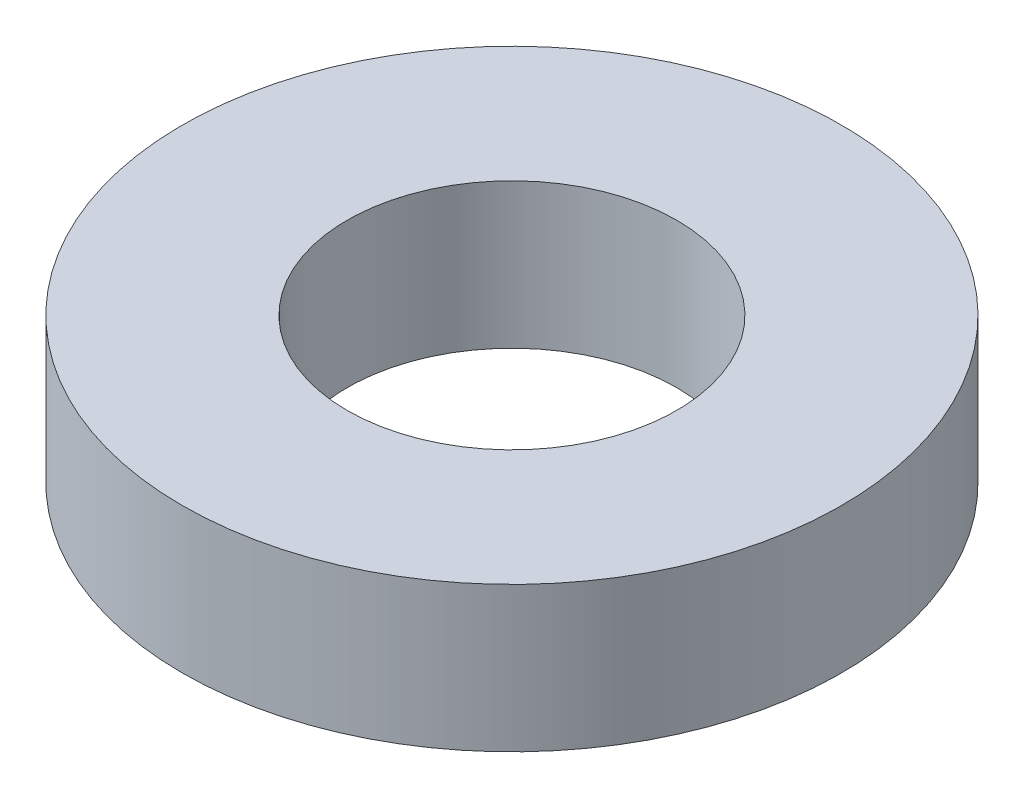
ISO-10303-21;
HEADER;
FILE_DESCRIPTION(('STEP AP214'),'2;1');
FILE_NAME('part.step','',(''),(''),'','','');
FILE_SCHEMA(('AUTOMOTIVE_DESIGN { 1 0 10303 214 1 1 1 1 }'));
ENDSEC;
DATA;
#1=APPLICATION_CONTEXT('core data for automotive mechanical design processes');
#2=APPLICATION_PROTOCOL_DEFINITION('international standard','automotive_design',2000,#1);
#3=PRODUCT_CONTEXT('',#1,'mechanical');
#4=PRODUCT('Part','Part','',(#3));
#5=PRODUCT_RELATED_PRODUCT_CATEGORY('part','',(#4));
#6=PRODUCT_DEFINITION_FORMATION('','',#4);
#7=PRODUCT_DEFINITION_CONTEXT('part definition',#1,'design');
#8=PRODUCT_DEFINITION('design','',#6,#7);
#9=PRODUCT_DEFINITION_SHAPE('','',#8);
#10=(LENGTH_UNIT() NAMED_UNIT(*) SI_UNIT(.MILLI.,.METRE.));
#11=(NAMED_UNIT(*) PLANE_ANGLE_UNIT() SI_UNIT($,.RADIAN.));
#12=(NAMED_UNIT(*) SI_UNIT($,.STERADIAN.) SOLID_ANGLE_UNIT());
#13=UNCERTAINTY_MEASURE_WITH_UNIT(LENGTH_MEASURE(1.E-05),#10,'distance_accuracy_value','');
#14=(GEOMETRIC_REPRESENTATION_CONTEXT(3) GLOBAL_UNCERTAINTY_ASSIGNED_CONTEXT((#13)) GLOBAL_UNIT_ASSIGNED_CONTEXT((#10,
#11,#12)) REPRESENTATION_CONTEXT('',''));
#15=CARTESIAN_POINT('',(0.,0.,0.));
#16=DIRECTION('',(0.,0.,1.));
#17=DIRECTION('',(1.,0.,0.));
#18=AXIS2_PLACEMENT_3D('',#15,#16,#17);
#19=CARTESIAN_POINT('',(0.,0.66,0.));
#20=DIRECTION('',(0.,1.,0.));
#21=DIRECTION('',(0.,0.,1.));
#22=AXIS2_PLACEMENT_3D('',#19,#20,#21);
#23=PLANE('',#22);
#24=CARTESIAN_POINT('',(0.,0.66,0.));
#25=DIRECTION('',(0.,1.,0.));
#26=DIRECTION('',(0.,0.,1.));
#27=AXIS2_PLACEMENT_3D('',#24,#25,#26);
#28=CIRCLE('',#27,3.);
#29=CARTESIAN_POINT('',(0.,0.66,3.));
#30=VERTEX_POINT('',#29);
#31=EDGE_CURVE('E10',#30,#30,#28,.T.);
#32=ORIENTED_EDGE('',*,*,#31,.T.);
#33=EDGE_LOOP('',(#32));
#34=FACE_BOUND('',#33,.T.);
#35=CARTESIAN_POINT('',(0.,0.66,0.));
#36=DIRECTION('',(0.,1.,0.));
#37=DIRECTION('',(0.,0.,1.));
#38=AXIS2_PLACEMENT_3D('',#35,#36,#37);
#39=CIRCLE('',#38,1.5);
#40=CARTESIAN_POINT('',(0.,0.66,1.5));
#41=VERTEX_POINT('',#40);
#42=EDGE_CURVE('E42',#41,#41,#39,.T.);
#43=ORIENTED_EDGE('',*,*,#42,.F.);
#44=EDGE_LOOP('',(#43));
#45=FACE_BOUND('',#44,.T.);
#46=ADVANCED_FACE('F31',(#34,#45),#23,.T.);
#47=CARTESIAN_POINT('',(0.,-0.66,0.));
#48=DIRECTION('',(0.,1.,0.));
#49=DIRECTION('',(0.,0.,1.));
#50=AXIS2_PLACEMENT_3D('',#47,#48,#49);
#51=PLANE('',#50);
#52=CARTESIAN_POINT('',(0.,-0.66,0.));
#53=DIRECTION('',(0.,1.,0.));
#54=DIRECTION('',(0.,0.,1.));
#55=AXIS2_PLACEMENT_3D('',#52,#53,#54);
#56=CIRCLE('',#55,3.);
#57=CARTESIAN_POINT('',(0.,-0.66,3.));
#58=VERTEX_POINT('',#57);
#59=EDGE_CURVE('E35',#58,#58,#56,.T.);
#60=ORIENTED_EDGE('',*,*,#59,.F.);
#61=EDGE_LOOP('',(#60));
#62=FACE_BOUND('',#61,.T.);
#63=CARTESIAN_POINT('',(0.,-0.66,0.));
#64=DIRECTION('',(0.,1.,0.));
#65=DIRECTION('',(0.,0.,1.));
#66=AXIS2_PLACEMENT_3D('',#63,#64,#65);
#67=CIRCLE('',#66,1.5);
#68=CARTESIAN_POINT('',(0.,-0.66,1.5));
#69=VERTEX_POINT('',#68);
#70=EDGE_CURVE('E44',#69,#69,#67,.T.);
#71=ORIENTED_EDGE('',*,*,#70,.T.);
#72=EDGE_LOOP('',(#71));
#73=FACE_BOUND('',#72,.T.);
#74=ADVANCED_FACE('F54',(#62,#73),#51,.F.);
#75=CARTESIAN_POINT('',(0.,0.66,0.));
#76=DIRECTION('',(0.,-1.,0.));
#77=DIRECTION('',(0.,0.,-1.));
#78=AXIS2_PLACEMENT_3D('',#75,#76,#77);
#79=CYLINDRICAL_SURFACE('',#78,3.);
#80=ORIENTED_EDGE('',*,*,#31,.F.);
#81=EDGE_LOOP('',(#80));
#82=FACE_BOUND('',#81,.T.);
#83=ORIENTED_EDGE('',*,*,#59,.T.);
#84=EDGE_LOOP('',(#83));
#85=FACE_BOUND('',#84,.T.);
#86=ADVANCED_FACE('F33',(#82,#85),#79,.T.);
#87=CARTESIAN_POINT('',(0.,0.66,0.));
#88=DIRECTION('',(0.,-1.,0.));
#89=DIRECTION('',(0.,0.,-1.));
#90=AXIS2_PLACEMENT_3D('',#87,#88,#89);
#91=CYLINDRICAL_SURFACE('',#90,1.5);
#92=ORIENTED_EDGE('',*,*,#42,.T.);
#93=EDGE_LOOP('',(#92));
#94=FACE_BOUND('',#93,.T.);
#95=ORIENTED_EDGE('',*,*,#70,.F.);
#96=EDGE_LOOP('',(#95));
#97=FACE_BOUND('',#96,.T.);
#98=ADVANCED_FACE('F50',(#94,#97),#91,.F.);
#99=CLOSED_SHELL('',(#46,#74,#86,#98));
#100=MANIFOLD_SOLID_BREP('B2',#99);
#101=ADVANCED_BREP_SHAPE_REPRESENTATION('',(#18,#100),#14);
#102=SHAPE_DEFINITION_REPRESENTATION(#9,#101);
ENDSEC;
END-ISO-10303-21;
